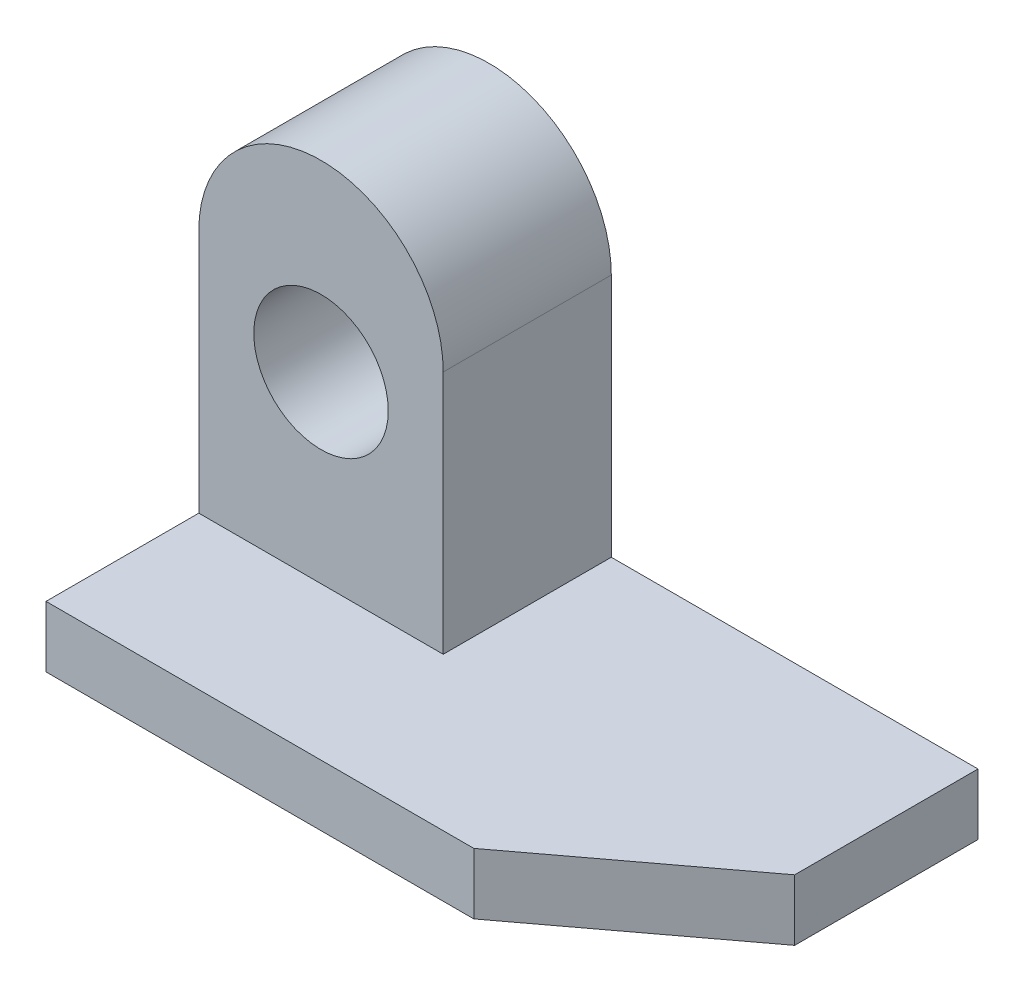
ISO-10303-21;
HEADER;
FILE_DESCRIPTION(('STEP AP214'),'2;1');
FILE_NAME('part.step','',(''),(''),'','','');
FILE_SCHEMA(('AUTOMOTIVE_DESIGN { 1 0 10303 214 1 1 1 1 }'));
ENDSEC;
DATA;
#1=APPLICATION_CONTEXT('core data for automotive mechanical design processes');
#2=APPLICATION_PROTOCOL_DEFINITION('international standard','automotive_design',2000,#1);
#3=PRODUCT_CONTEXT('',#1,'mechanical');
#4=PRODUCT('Part','Part','',(#3));
#5=PRODUCT_RELATED_PRODUCT_CATEGORY('part','',(#4));
#6=PRODUCT_DEFINITION_FORMATION('','',#4);
#7=PRODUCT_DEFINITION_CONTEXT('part definition',#1,'design');
#8=PRODUCT_DEFINITION('design','',#6,#7);
#9=PRODUCT_DEFINITION_SHAPE('','',#8);
#10=(LENGTH_UNIT() NAMED_UNIT(*) SI_UNIT(.MILLI.,.METRE.));
#11=(NAMED_UNIT(*) PLANE_ANGLE_UNIT() SI_UNIT($,.RADIAN.));
#12=(NAMED_UNIT(*) SI_UNIT($,.STERADIAN.) SOLID_ANGLE_UNIT());
#13=UNCERTAINTY_MEASURE_WITH_UNIT(LENGTH_MEASURE(1.E-05),#10,'distance_accuracy_value','');
#14=(GEOMETRIC_REPRESENTATION_CONTEXT(3) GLOBAL_UNCERTAINTY_ASSIGNED_CONTEXT((#13)) GLOBAL_UNIT_ASSIGNED_CONTEXT((#10,
#11,#12)) REPRESENTATION_CONTEXT('',''));
#15=CARTESIAN_POINT('',(0.,0.,0.));
#16=DIRECTION('',(0.,0.,1.));
#17=DIRECTION('',(1.,0.,0.));
#18=AXIS2_PLACEMENT_3D('',#15,#16,#17);
#19=CARTESIAN_POINT('',(-160.,100.,-60.));
#20=DIRECTION('',(0.,0.,-1.));
#21=DIRECTION('',(-1.,0.,0.));
#22=AXIS2_PLACEMENT_3D('',#19,#20,#21);
#23=CYLINDRICAL_SURFACE('',#22,40.);
#24=DIRECTION('',(0.,0.,1.));
#25=VECTOR('',#24,1.);
#26=CARTESIAN_POINT('',(-120.,100.,-60.));
#27=LINE('',#26,#25);
#28=CARTESIAN_POINT('',(-120.,100.,-60.));
#29=VERTEX_POINT('',#28);
#30=CARTESIAN_POINT('',(-120.,100.,-5.));
#31=VERTEX_POINT('',#30);
#32=EDGE_CURVE('E102',#29,#31,#27,.T.);
#33=ORIENTED_EDGE('',*,*,#32,.F.);
#34=CARTESIAN_POINT('',(-160.,100.,-60.));
#35=DIRECTION('',(0.,0.,1.));
#36=DIRECTION('',(1.,0.,0.));
#37=AXIS2_PLACEMENT_3D('',#34,#35,#36);
#38=CIRCLE('',#37,40.);
#39=CARTESIAN_POINT('',(-200.,100.,-60.));
#40=VERTEX_POINT('',#39);
#41=EDGE_CURVE('E43',#40,#29,#38,.F.);
#42=ORIENTED_EDGE('',*,*,#41,.F.);
#43=DIRECTION('',(0.,0.,1.));
#44=VECTOR('',#43,1.);
#45=CARTESIAN_POINT('',(-200.,100.,-60.));
#46=LINE('',#45,#44);
#47=CARTESIAN_POINT('',(-200.,100.,-5.));
#48=VERTEX_POINT('',#47);
#49=EDGE_CURVE('E163',#48,#40,#46,.F.);
#50=ORIENTED_EDGE('',*,*,#49,.F.);
#51=CARTESIAN_POINT('',(-160.,100.,-5.));
#52=DIRECTION('',(0.,0.,-1.));
#53=DIRECTION('',(-1.,0.,0.));
#54=AXIS2_PLACEMENT_3D('',#51,#52,#53);
#55=CIRCLE('',#54,40.);
#56=EDGE_CURVE('E11',#31,#48,#55,.F.);
#57=ORIENTED_EDGE('',*,*,#56,.F.);
#58=EDGE_LOOP('',(#33,#42,#50,#57));
#59=FACE_BOUND('',#58,.T.);
#60=ADVANCED_FACE('F35',(#59),#23,.T.);
#61=CARTESIAN_POINT('',(0.,20.,0.));
#62=DIRECTION('',(0.,-1.,0.));
#63=DIRECTION('',(0.,0.,-1.));
#64=AXIS2_PLACEMENT_3D('',#61,#62,#63);
#65=PLANE('',#64);
#66=DIRECTION('',(0.,0.,-1.));
#67=VECTOR('',#66,1.);
#68=CARTESIAN_POINT('',(-120.,20.,-60.));
#69=LINE('',#68,#67);
#70=CARTESIAN_POINT('',(-120.,20.,-5.));
#71=VERTEX_POINT('',#70);
#72=CARTESIAN_POINT('',(-120.,20.,-60.));
#73=VERTEX_POINT('',#72);
#74=EDGE_CURVE('E101',#71,#73,#69,.T.);
#75=ORIENTED_EDGE('',*,*,#74,.F.);
#76=DIRECTION('',(1.,0.,0.));
#77=VECTOR('',#76,1.);
#78=CARTESIAN_POINT('',(-200.,20.,-5.));
#79=LINE('',#78,#77);
#80=CARTESIAN_POINT('',(-200.,20.,-5.));
#81=VERTEX_POINT('',#80);
#82=EDGE_CURVE('E111',#81,#71,#79,.T.);
#83=ORIENTED_EDGE('',*,*,#82,.F.);
#84=DIRECTION('',(0.,0.,1.));
#85=VECTOR('',#84,1.);
#86=CARTESIAN_POINT('',(-200.,20.,45.));
#87=LINE('',#86,#85);
#88=CARTESIAN_POINT('',(-200.,20.,45.));
#89=VERTEX_POINT('',#88);
#90=EDGE_CURVE('E128',#81,#89,#87,.T.);
#91=ORIENTED_EDGE('',*,*,#90,.T.);
#92=DIRECTION('',(1.,0.,0.));
#93=VECTOR('',#92,1.);
#94=CARTESIAN_POINT('',(-60.,20.,45.));
#95=LINE('',#94,#93);
#96=CARTESIAN_POINT('',(-60.,20.,45.));
#97=VERTEX_POINT('',#96);
#98=EDGE_CURVE('E130',#89,#97,#95,.T.);
#99=ORIENTED_EDGE('',*,*,#98,.T.);
#100=DIRECTION('',(0.8,0.,-0.6));
#101=VECTOR('',#100,1.);
#102=CARTESIAN_POINT('',(0.,20.,0.));
#103=LINE('',#102,#101);
#104=CARTESIAN_POINT('',(0.,20.,0.));
#105=VERTEX_POINT('',#104);
#106=EDGE_CURVE('E133',#97,#105,#103,.T.);
#107=ORIENTED_EDGE('',*,*,#106,.T.);
#108=DIRECTION('',(0.,0.,-1.));
#109=VECTOR('',#108,1.);
#110=CARTESIAN_POINT('',(0.,20.,-60.));
#111=LINE('',#110,#109);
#112=CARTESIAN_POINT('',(0.,20.,-60.));
#113=VERTEX_POINT('',#112);
#114=EDGE_CURVE('E135',#105,#113,#111,.T.);
#115=ORIENTED_EDGE('',*,*,#114,.T.);
#116=DIRECTION('',(-1.,0.,0.));
#117=VECTOR('',#116,1.);
#118=CARTESIAN_POINT('',(-200.,20.,-60.));
#119=LINE('',#118,#117);
#120=EDGE_CURVE('E114',#113,#73,#119,.T.);
#121=ORIENTED_EDGE('',*,*,#120,.T.);
#122=EDGE_LOOP('',(#75,#83,#91,#99,#107,#115,#121));
#123=FACE_BOUND('',#122,.T.);
#124=ADVANCED_FACE('F110',(#123),#65,.F.);
#125=CARTESIAN_POINT('',(-200.,20.,45.));
#126=DIRECTION('',(1.,0.,0.));
#127=DIRECTION('',(0.,0.,-1.));
#128=AXIS2_PLACEMENT_3D('',#125,#126,#127);
#129=PLANE('',#128);
#130=DIRECTION('',(0.,-1.,0.));
#131=VECTOR('',#130,1.);
#132=CARTESIAN_POINT('',(-200.,140.,-5.));
#133=LINE('',#132,#131);
#134=EDGE_CURVE('E104',#48,#81,#133,.T.);
#135=ORIENTED_EDGE('',*,*,#134,.F.);
#136=ORIENTED_EDGE('',*,*,#49,.T.);
#137=DIRECTION('',(0.,-1.,0.));
#138=VECTOR('',#137,1.);
#139=CARTESIAN_POINT('',(-200.,20.,-60.));
#140=LINE('',#139,#138);
#141=CARTESIAN_POINT('',(-200.,0.,-60.));
#142=VERTEX_POINT('',#141);
#143=EDGE_CURVE('E138',#40,#142,#140,.T.);
#144=ORIENTED_EDGE('',*,*,#143,.T.);
#145=DIRECTION('',(0.,0.,1.));
#146=VECTOR('',#145,1.);
#147=CARTESIAN_POINT('',(-200.,0.,45.));
#148=LINE('',#147,#146);
#149=CARTESIAN_POINT('',(-200.,0.,45.));
#150=VERTEX_POINT('',#149);
#151=EDGE_CURVE('E127',#142,#150,#148,.T.);
#152=ORIENTED_EDGE('',*,*,#151,.T.);
#153=DIRECTION('',(0.,-1.,0.));
#154=VECTOR('',#153,1.);
#155=CARTESIAN_POINT('',(-200.,20.,45.));
#156=LINE('',#155,#154);
#157=EDGE_CURVE('E159',#89,#150,#156,.T.);
#158=ORIENTED_EDGE('',*,*,#157,.F.);
#159=ORIENTED_EDGE('',*,*,#90,.F.);
#160=EDGE_LOOP('',(#135,#136,#144,#152,#158,#159));
#161=FACE_BOUND('',#160,.T.);
#162=ADVANCED_FACE('F168',(#161),#129,.F.);
#163=CARTESIAN_POINT('',(-60.,20.,45.));
#164=DIRECTION('',(0.,0.,-1.));
#165=DIRECTION('',(-1.,0.,0.));
#166=AXIS2_PLACEMENT_3D('',#163,#164,#165);
#167=PLANE('',#166);
#168=DIRECTION('',(1.,0.,0.));
#169=VECTOR('',#168,1.);
#170=CARTESIAN_POINT('',(-60.,0.,45.));
#171=LINE('',#170,#169);
#172=CARTESIAN_POINT('',(-60.,0.,45.));
#173=VERTEX_POINT('',#172);
#174=EDGE_CURVE('E141',#150,#173,#171,.T.);
#175=ORIENTED_EDGE('',*,*,#174,.T.);
#176=DIRECTION('',(0.,-1.,0.));
#177=VECTOR('',#176,1.);
#178=CARTESIAN_POINT('',(-60.,20.,45.));
#179=LINE('',#178,#177);
#180=EDGE_CURVE('E156',#97,#173,#179,.T.);
#181=ORIENTED_EDGE('',*,*,#180,.F.);
#182=ORIENTED_EDGE('',*,*,#98,.F.);
#183=ORIENTED_EDGE('',*,*,#157,.T.);
#184=EDGE_LOOP('',(#175,#181,#182,#183));
#185=FACE_BOUND('',#184,.T.);
#186=ADVANCED_FACE('F173',(#185),#167,.F.);
#187=CARTESIAN_POINT('',(0.,20.,0.));
#188=DIRECTION('',(-0.6,0.,-0.8));
#189=DIRECTION('',(-0.8,0.,0.6));
#190=AXIS2_PLACEMENT_3D('',#187,#188,#189);
#191=PLANE('',#190);
#192=DIRECTION('',(0.8,0.,-0.6));
#193=VECTOR('',#192,1.);
#194=CARTESIAN_POINT('',(0.,0.,0.));
#195=LINE('',#194,#193);
#196=CARTESIAN_POINT('',(0.,0.,0.));
#197=VERTEX_POINT('',#196);
#198=EDGE_CURVE('E143',#173,#197,#195,.T.);
#199=ORIENTED_EDGE('',*,*,#198,.T.);
#200=DIRECTION('',(0.,-1.,0.));
#201=VECTOR('',#200,1.);
#202=CARTESIAN_POINT('',(0.,20.,0.));
#203=LINE('',#202,#201);
#204=EDGE_CURVE('E153',#105,#197,#203,.T.);
#205=ORIENTED_EDGE('',*,*,#204,.F.);
#206=ORIENTED_EDGE('',*,*,#106,.F.);
#207=ORIENTED_EDGE('',*,*,#180,.T.);
#208=EDGE_LOOP('',(#199,#205,#206,#207));
#209=FACE_BOUND('',#208,.T.);
#210=ADVANCED_FACE('F178',(#209),#191,.F.);
#211=CARTESIAN_POINT('',(0.,20.,-60.));
#212=DIRECTION('',(-1.,0.,0.));
#213=DIRECTION('',(0.,0.,1.));
#214=AXIS2_PLACEMENT_3D('',#211,#212,#213);
#215=PLANE('',#214);
#216=DIRECTION('',(0.,0.,-1.));
#217=VECTOR('',#216,1.);
#218=CARTESIAN_POINT('',(0.,0.,-60.));
#219=LINE('',#218,#217);
#220=CARTESIAN_POINT('',(0.,0.,-60.));
#221=VERTEX_POINT('',#220);
#222=EDGE_CURVE('E145',#197,#221,#219,.T.);
#223=ORIENTED_EDGE('',*,*,#222,.T.);
#224=DIRECTION('',(0.,-1.,0.));
#225=VECTOR('',#224,1.);
#226=CARTESIAN_POINT('',(0.,20.,-60.));
#227=LINE('',#226,#225);
#228=EDGE_CURVE('E150',#113,#221,#227,.T.);
#229=ORIENTED_EDGE('',*,*,#228,.F.);
#230=ORIENTED_EDGE('',*,*,#114,.F.);
#231=ORIENTED_EDGE('',*,*,#204,.T.);
#232=EDGE_LOOP('',(#223,#229,#230,#231));
#233=FACE_BOUND('',#232,.T.);
#234=ADVANCED_FACE('F182',(#233),#215,.F.);
#235=CARTESIAN_POINT('',(-200.,20.,-60.));
#236=DIRECTION('',(0.,0.,1.));
#237=DIRECTION('',(1.,0.,0.));
#238=AXIS2_PLACEMENT_3D('',#235,#236,#237);
#239=PLANE('',#238);
#240=CARTESIAN_POINT('',(-160.,80.,-60.));
#241=DIRECTION('',(0.,0.,1.));
#242=DIRECTION('',(1.,0.,0.));
#243=AXIS2_PLACEMENT_3D('',#240,#241,#242);
#244=CIRCLE('',#243,22.);
#245=CARTESIAN_POINT('',(-138.,80.,-60.));
#246=VERTEX_POINT('',#245);
#247=EDGE_CURVE('E118',#246,#246,#244,.T.);
#248=ORIENTED_EDGE('',*,*,#247,.T.);
#249=EDGE_LOOP('',(#248));
#250=FACE_BOUND('',#249,.T.);
#251=ORIENTED_EDGE('',*,*,#143,.F.);
#252=ORIENTED_EDGE('',*,*,#41,.T.);
#253=DIRECTION('',(0.,-1.,0.));
#254=VECTOR('',#253,1.);
#255=CARTESIAN_POINT('',(-120.,140.,-60.));
#256=LINE('',#255,#254);
#257=EDGE_CURVE('E105',#29,#73,#256,.T.);
#258=ORIENTED_EDGE('',*,*,#257,.T.);
#259=ORIENTED_EDGE('',*,*,#120,.F.);
#260=ORIENTED_EDGE('',*,*,#228,.T.);
#261=DIRECTION('',(-1.,0.,0.));
#262=VECTOR('',#261,1.);
#263=CARTESIAN_POINT('',(-200.,0.,-60.));
#264=LINE('',#263,#262);
#265=EDGE_CURVE('E131',#221,#142,#264,.T.);
#266=ORIENTED_EDGE('',*,*,#265,.T.);
#267=EDGE_LOOP('',(#251,#252,#258,#259,#260,#266));
#268=FACE_BOUND('',#267,.T.);
#269=ADVANCED_FACE('F166',(#250,#268),#239,.F.);
#270=CARTESIAN_POINT('',(0.,0.,0.));
#271=DIRECTION('',(0.,-1.,0.));
#272=DIRECTION('',(0.,0.,-1.));
#273=AXIS2_PLACEMENT_3D('',#270,#271,#272);
#274=PLANE('',#273);
#275=ORIENTED_EDGE('',*,*,#151,.F.);
#276=ORIENTED_EDGE('',*,*,#265,.F.);
#277=ORIENTED_EDGE('',*,*,#222,.F.);
#278=ORIENTED_EDGE('',*,*,#198,.F.);
#279=ORIENTED_EDGE('',*,*,#174,.F.);
#280=EDGE_LOOP('',(#275,#276,#277,#278,#279));
#281=FACE_BOUND('',#280,.T.);
#282=ADVANCED_FACE('F187',(#281),#274,.T.);
#283=CARTESIAN_POINT('',(-200.,140.,-5.));
#284=DIRECTION('',(0.,0.,-1.));
#285=DIRECTION('',(-1.,0.,0.));
#286=AXIS2_PLACEMENT_3D('',#283,#284,#285);
#287=PLANE('',#286);
#288=CARTESIAN_POINT('',(-160.,80.,-5.));
#289=DIRECTION('',(0.,0.,1.));
#290=DIRECTION('',(1.,0.,0.));
#291=AXIS2_PLACEMENT_3D('',#288,#289,#290);
#292=CIRCLE('',#291,22.);
#293=CARTESIAN_POINT('',(-138.,80.,-5.));
#294=VERTEX_POINT('',#293);
#295=EDGE_CURVE('E121',#294,#294,#292,.T.);
#296=ORIENTED_EDGE('',*,*,#295,.F.);
#297=EDGE_LOOP('',(#296));
#298=FACE_BOUND('',#297,.T.);
#299=DIRECTION('',(0.,-1.,0.));
#300=VECTOR('',#299,1.);
#301=CARTESIAN_POINT('',(-120.,140.,-5.));
#302=LINE('',#301,#300);
#303=EDGE_CURVE('E97',#31,#71,#302,.T.);
#304=ORIENTED_EDGE('',*,*,#303,.F.);
#305=ORIENTED_EDGE('',*,*,#56,.T.);
#306=ORIENTED_EDGE('',*,*,#134,.T.);
#307=ORIENTED_EDGE('',*,*,#82,.T.);
#308=EDGE_LOOP('',(#304,#305,#306,#307));
#309=FACE_BOUND('',#308,.T.);
#310=ADVANCED_FACE('F116',(#298,#309),#287,.F.);
#311=CARTESIAN_POINT('',(-120.,140.,-60.));
#312=DIRECTION('',(-1.,0.,0.));
#313=DIRECTION('',(0.,0.,1.));
#314=AXIS2_PLACEMENT_3D('',#311,#312,#313);
#315=PLANE('',#314);
#316=ORIENTED_EDGE('',*,*,#257,.F.);
#317=ORIENTED_EDGE('',*,*,#32,.T.);
#318=ORIENTED_EDGE('',*,*,#303,.T.);
#319=ORIENTED_EDGE('',*,*,#74,.T.);
#320=EDGE_LOOP('',(#316,#317,#318,#319));
#321=FACE_BOUND('',#320,.T.);
#322=ADVANCED_FACE('F100',(#321),#315,.F.);
#323=CARTESIAN_POINT('',(-160.,80.,-125.));
#324=DIRECTION('',(0.,0.,1.));
#325=DIRECTION('',(1.,0.,0.));
#326=AXIS2_PLACEMENT_3D('',#323,#324,#325);
#327=CYLINDRICAL_SURFACE('',#326,22.);
#328=ORIENTED_EDGE('',*,*,#295,.T.);
#329=EDGE_LOOP('',(#328));
#330=FACE_BOUND('',#329,.T.);
#331=ORIENTED_EDGE('',*,*,#247,.F.);
#332=EDGE_LOOP('',(#331));
#333=FACE_BOUND('',#332,.T.);
#334=ADVANCED_FACE('F209',(#330,#333),#327,.F.);
#335=CLOSED_SHELL('',(#60,#124,#162,#186,#210,#234,#269,#282,#310,#322,#334));
#336=MANIFOLD_SOLID_BREP('B2',#335);
#337=ADVANCED_BREP_SHAPE_REPRESENTATION('',(#18,#336),#14);
#338=SHAPE_DEFINITION_REPRESENTATION(#9,#337);
ENDSEC;
END-ISO-10303-21;
